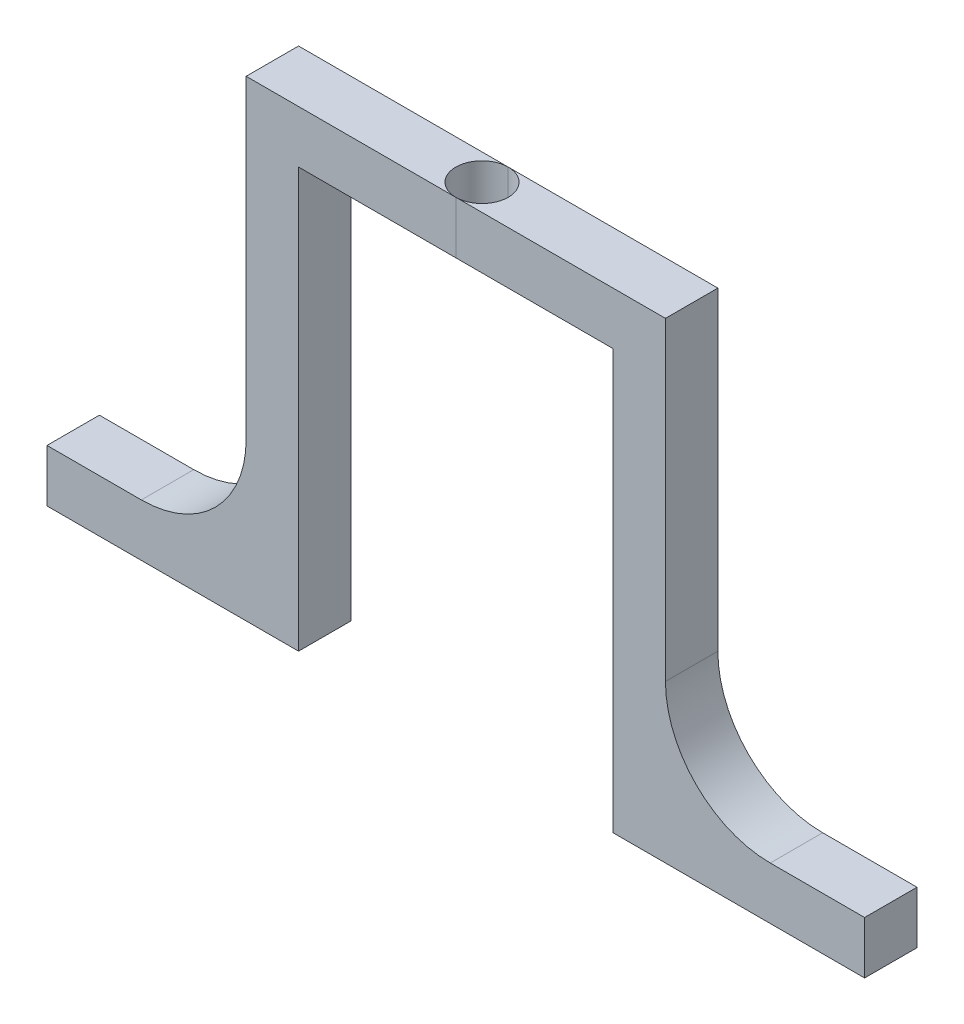
ISO-10303-21;
HEADER;
FILE_DESCRIPTION(('STEP AP214'),'2;1');
FILE_NAME('part.step','',(''),(''),'','','');
FILE_SCHEMA(('AUTOMOTIVE_DESIGN { 1 0 10303 214 1 1 1 1 }'));
ENDSEC;
DATA;
#1=APPLICATION_CONTEXT('core data for automotive mechanical design processes');
#2=APPLICATION_PROTOCOL_DEFINITION('international standard','automotive_design',2000,#1);
#3=PRODUCT_CONTEXT('',#1,'mechanical');
#4=PRODUCT('Part','Part','',(#3));
#5=PRODUCT_RELATED_PRODUCT_CATEGORY('part','',(#4));
#6=PRODUCT_DEFINITION_FORMATION('','',#4);
#7=PRODUCT_DEFINITION_CONTEXT('part definition',#1,'design');
#8=PRODUCT_DEFINITION('design','',#6,#7);
#9=PRODUCT_DEFINITION_SHAPE('','',#8);
#10=(LENGTH_UNIT() NAMED_UNIT(*) SI_UNIT(.MILLI.,.METRE.));
#11=(NAMED_UNIT(*) PLANE_ANGLE_UNIT() SI_UNIT($,.RADIAN.));
#12=(NAMED_UNIT(*) SI_UNIT($,.STERADIAN.) SOLID_ANGLE_UNIT());
#13=UNCERTAINTY_MEASURE_WITH_UNIT(LENGTH_MEASURE(1.E-05),#10,'distance_accuracy_value','');
#14=(GEOMETRIC_REPRESENTATION_CONTEXT(3) GLOBAL_UNCERTAINTY_ASSIGNED_CONTEXT((#13)) GLOBAL_UNIT_ASSIGNED_CONTEXT((#10,
#11,#12)) REPRESENTATION_CONTEXT('',''));
#15=CARTESIAN_POINT('',(0.,0.,0.));
#16=DIRECTION('',(0.,0.,1.));
#17=DIRECTION('',(1.,0.,0.));
#18=AXIS2_PLACEMENT_3D('',#15,#16,#17);
#19=CARTESIAN_POINT('',(0.,0.,5.));
#20=DIRECTION('',(0.,0.,1.));
#21=DIRECTION('',(1.,0.,0.));
#22=AXIS2_PLACEMENT_3D('',#19,#20,#21);
#23=PLANE('',#22);
#24=DIRECTION('',(1.,0.,0.));
#25=VECTOR('',#24,1.);
#26=CARTESIAN_POINT('',(23.9999999999999,40.,5.));
#27=LINE('',#26,#25);
#28=CARTESIAN_POINT('',(23.9999999999999,40.,5.));
#29=VERTEX_POINT('',#28);
#30=CARTESIAN_POINT('',(39.,40.,5.));
#31=VERTEX_POINT('',#30);
#32=EDGE_CURVE('E170',#29,#31,#27,.T.);
#33=ORIENTED_EDGE('',*,*,#32,.T.);
#34=DIRECTION('',(0.,1.,0.));
#35=VECTOR('',#34,1.);
#36=CARTESIAN_POINT('',(39.,32.9289321881345,5.));
#37=LINE('',#36,#35);
#38=CARTESIAN_POINT('',(39.,45.,5.));
#39=VERTEX_POINT('',#38);
#40=EDGE_CURVE('E58',#31,#39,#37,.T.);
#41=ORIENTED_EDGE('',*,*,#40,.T.);
#42=DIRECTION('',(-1.,0.,0.));
#43=VECTOR('',#42,1.);
#44=CARTESIAN_POINT('',(59.0000000000002,45.,5.));
#45=LINE('',#44,#43);
#46=CARTESIAN_POINT('',(18.9999999999998,45.,5.));
#47=VERTEX_POINT('',#46);
#48=EDGE_CURVE('E167',#39,#47,#45,.T.);
#49=ORIENTED_EDGE('',*,*,#48,.T.);
#50=DIRECTION('',(0.,-1.,0.));
#51=VECTOR('',#50,1.);
#52=CARTESIAN_POINT('',(19.,5.,5.));
#53=LINE('',#52,#51);
#54=CARTESIAN_POINT('',(18.9999999999999,15.,5.));
#55=VERTEX_POINT('',#54);
#56=EDGE_CURVE('E164',#47,#55,#53,.T.);
#57=ORIENTED_EDGE('',*,*,#56,.T.);
#58=CARTESIAN_POINT('',(8.99999999999994,15.,5.));
#59=DIRECTION('',(0.,0.,1.));
#60=DIRECTION('',(1.,0.,0.));
#61=AXIS2_PLACEMENT_3D('',#58,#59,#60);
#62=CIRCLE('',#61,10.);
#63=CARTESIAN_POINT('',(8.99999999999994,5.,5.));
#64=VERTEX_POINT('',#63);
#65=EDGE_CURVE('E163',#55,#64,#62,.F.);
#66=ORIENTED_EDGE('',*,*,#65,.T.);
#67=DIRECTION('',(-1.,0.,0.));
#68=VECTOR('',#67,1.);
#69=CARTESIAN_POINT('',(0.,5.,5.));
#70=LINE('',#69,#68);
#71=CARTESIAN_POINT('',(0.,5.,5.));
#72=VERTEX_POINT('',#71);
#73=EDGE_CURVE('E124',#64,#72,#70,.T.);
#74=ORIENTED_EDGE('',*,*,#73,.T.);
#75=DIRECTION('',(0.,-1.,0.));
#76=VECTOR('',#75,1.);
#77=CARTESIAN_POINT('',(0.,5.,5.));
#78=LINE('',#77,#76);
#79=CARTESIAN_POINT('',(0.,0.,5.));
#80=VERTEX_POINT('',#79);
#81=EDGE_CURVE('E120',#72,#80,#78,.T.);
#82=ORIENTED_EDGE('',*,*,#81,.T.);
#83=DIRECTION('',(1.,0.,0.));
#84=VECTOR('',#83,1.);
#85=CARTESIAN_POINT('',(0.,0.,5.));
#86=LINE('',#85,#84);
#87=CARTESIAN_POINT('',(24.,0.,5.));
#88=VERTEX_POINT('',#87);
#89=EDGE_CURVE('E109',#80,#88,#86,.T.);
#90=ORIENTED_EDGE('',*,*,#89,.T.);
#91=DIRECTION('',(0.,1.,0.));
#92=VECTOR('',#91,1.);
#93=CARTESIAN_POINT('',(24.,0.,5.));
#94=LINE('',#93,#92);
#95=EDGE_CURVE('E119',#88,#29,#94,.T.);
#96=ORIENTED_EDGE('',*,*,#95,.T.);
#97=EDGE_LOOP('',(#33,#41,#49,#57,#66,#74,#82,#90,#96));
#98=FACE_BOUND('',#97,.T.);
#99=ADVANCED_FACE('F43',(#98),#23,.T.);
#100=CARTESIAN_POINT('',(0.,0.,0.));
#101=DIRECTION('',(0.,0.,1.));
#102=DIRECTION('',(1.,0.,0.));
#103=AXIS2_PLACEMENT_3D('',#100,#101,#102);
#104=PLANE('',#103);
#105=DIRECTION('',(0.,1.,0.));
#106=VECTOR('',#105,1.);
#107=CARTESIAN_POINT('',(39.,32.9289321881345,0.));
#108=LINE('',#107,#106);
#109=CARTESIAN_POINT('',(39.,40.,0.));
#110=VERTEX_POINT('',#109);
#111=CARTESIAN_POINT('',(39.,45.,0.));
#112=VERTEX_POINT('',#111);
#113=EDGE_CURVE('E52',#110,#112,#108,.T.);
#114=ORIENTED_EDGE('',*,*,#113,.F.);
#115=DIRECTION('',(1.,0.,0.));
#116=VECTOR('',#115,1.);
#117=CARTESIAN_POINT('',(54.0000000000001,40.,0.));
#118=LINE('',#117,#116);
#119=CARTESIAN_POINT('',(23.9999999999999,40.,0.));
#120=VERTEX_POINT('',#119);
#121=EDGE_CURVE('E144',#120,#110,#118,.T.);
#122=ORIENTED_EDGE('',*,*,#121,.F.);
#123=DIRECTION('',(0.,1.,0.));
#124=VECTOR('',#123,1.);
#125=CARTESIAN_POINT('',(24.,0.,0.));
#126=LINE('',#125,#124);
#127=CARTESIAN_POINT('',(24.,0.,0.));
#128=VERTEX_POINT('',#127);
#129=EDGE_CURVE('E132',#128,#120,#126,.T.);
#130=ORIENTED_EDGE('',*,*,#129,.F.);
#131=DIRECTION('',(1.,0.,0.));
#132=VECTOR('',#131,1.);
#133=CARTESIAN_POINT('',(0.,0.,0.));
#134=LINE('',#133,#132);
#135=CARTESIAN_POINT('',(0.,0.,0.));
#136=VERTEX_POINT('',#135);
#137=EDGE_CURVE('E133',#136,#128,#134,.T.);
#138=ORIENTED_EDGE('',*,*,#137,.F.);
#139=DIRECTION('',(0.,-1.,0.));
#140=VECTOR('',#139,1.);
#141=CARTESIAN_POINT('',(0.,5.,0.));
#142=LINE('',#141,#140);
#143=CARTESIAN_POINT('',(0.,5.,0.));
#144=VERTEX_POINT('',#143);
#145=EDGE_CURVE('E131',#144,#136,#142,.T.);
#146=ORIENTED_EDGE('',*,*,#145,.F.);
#147=DIRECTION('',(-1.,0.,0.));
#148=VECTOR('',#147,1.);
#149=CARTESIAN_POINT('',(0.,5.,0.));
#150=LINE('',#149,#148);
#151=CARTESIAN_POINT('',(8.99999999999994,5.,0.));
#152=VERTEX_POINT('',#151);
#153=EDGE_CURVE('E154',#152,#144,#150,.T.);
#154=ORIENTED_EDGE('',*,*,#153,.F.);
#155=CARTESIAN_POINT('',(8.99999999999994,15.,0.));
#156=DIRECTION('',(0.,0.,1.));
#157=DIRECTION('',(1.,0.,0.));
#158=AXIS2_PLACEMENT_3D('',#155,#156,#157);
#159=CIRCLE('',#158,10.);
#160=CARTESIAN_POINT('',(18.9999999999999,15.,0.));
#161=VERTEX_POINT('',#160);
#162=EDGE_CURVE('E161',#152,#161,#159,.T.);
#163=ORIENTED_EDGE('',*,*,#162,.T.);
#164=DIRECTION('',(0.,-1.,0.));
#165=VECTOR('',#164,1.);
#166=CARTESIAN_POINT('',(19.,5.,0.));
#167=LINE('',#166,#165);
#168=CARTESIAN_POINT('',(18.9999999999998,45.,0.));
#169=VERTEX_POINT('',#168);
#170=EDGE_CURVE('E157',#169,#161,#167,.T.);
#171=ORIENTED_EDGE('',*,*,#170,.F.);
#172=DIRECTION('',(-1.,0.,0.));
#173=VECTOR('',#172,1.);
#174=CARTESIAN_POINT('',(18.9999999999998,45.,0.));
#175=LINE('',#174,#173);
#176=EDGE_CURVE('E148',#112,#169,#175,.T.);
#177=ORIENTED_EDGE('',*,*,#176,.F.);
#178=EDGE_LOOP('',(#114,#122,#130,#138,#146,#154,#163,#171,#177));
#179=FACE_BOUND('',#178,.T.);
#180=ADVANCED_FACE('F182',(#179),#104,.F.);
#181=CARTESIAN_POINT('',(0.,5.,5.));
#182=DIRECTION('',(1.,0.,0.));
#183=DIRECTION('',(0.,0.,-1.));
#184=AXIS2_PLACEMENT_3D('',#181,#182,#183);
#185=PLANE('',#184);
#186=ORIENTED_EDGE('',*,*,#145,.T.);
#187=DIRECTION('',(0.,0.,-1.));
#188=VECTOR('',#187,1.);
#189=CARTESIAN_POINT('',(0.,0.,5.));
#190=LINE('',#189,#188);
#191=EDGE_CURVE('E113',#80,#136,#190,.T.);
#192=ORIENTED_EDGE('',*,*,#191,.F.);
#193=ORIENTED_EDGE('',*,*,#81,.F.);
#194=DIRECTION('',(0.,0.,-1.));
#195=VECTOR('',#194,1.);
#196=CARTESIAN_POINT('',(0.,5.,5.));
#197=LINE('',#196,#195);
#198=EDGE_CURVE('E137',#72,#144,#197,.T.);
#199=ORIENTED_EDGE('',*,*,#198,.T.);
#200=EDGE_LOOP('',(#186,#192,#193,#199));
#201=FACE_BOUND('',#200,.T.);
#202=ADVANCED_FACE('F129',(#201),#185,.F.);
#203=CARTESIAN_POINT('',(0.,0.,5.));
#204=DIRECTION('',(0.,1.,0.));
#205=DIRECTION('',(0.,0.,1.));
#206=AXIS2_PLACEMENT_3D('',#203,#204,#205);
#207=PLANE('',#206);
#208=ORIENTED_EDGE('',*,*,#137,.T.);
#209=DIRECTION('',(0.,0.,-1.));
#210=VECTOR('',#209,1.);
#211=CARTESIAN_POINT('',(24.,0.,5.));
#212=LINE('',#211,#210);
#213=EDGE_CURVE('E116',#88,#128,#212,.T.);
#214=ORIENTED_EDGE('',*,*,#213,.F.);
#215=ORIENTED_EDGE('',*,*,#89,.F.);
#216=ORIENTED_EDGE('',*,*,#191,.T.);
#217=EDGE_LOOP('',(#208,#214,#215,#216));
#218=FACE_BOUND('',#217,.T.);
#219=ADVANCED_FACE('F111',(#218),#207,.F.);
#220=CARTESIAN_POINT('',(24.,0.,5.));
#221=DIRECTION('',(-1.,0.,0.));
#222=DIRECTION('',(0.,-1.,0.));
#223=AXIS2_PLACEMENT_3D('',#220,#221,#222);
#224=PLANE('',#223);
#225=ORIENTED_EDGE('',*,*,#129,.T.);
#226=DIRECTION('',(0.,0.,-1.));
#227=VECTOR('',#226,1.);
#228=CARTESIAN_POINT('',(23.9999999999999,40.,5.));
#229=LINE('',#228,#227);
#230=EDGE_CURVE('E145',#29,#120,#229,.T.);
#231=ORIENTED_EDGE('',*,*,#230,.F.);
#232=ORIENTED_EDGE('',*,*,#95,.F.);
#233=ORIENTED_EDGE('',*,*,#213,.T.);
#234=EDGE_LOOP('',(#225,#231,#232,#233));
#235=FACE_BOUND('',#234,.T.);
#236=ADVANCED_FACE('F189',(#235),#224,.F.);
#237=CARTESIAN_POINT('',(54.0000000000001,40.,5.));
#238=DIRECTION('',(0.,1.,0.));
#239=DIRECTION('',(-1.,0.,0.));
#240=AXIS2_PLACEMENT_3D('',#237,#238,#239);
#241=PLANE('',#240);
#242=ORIENTED_EDGE('',*,*,#121,.T.);
#243=CARTESIAN_POINT('',(39.,40.,2.50000000000001));
#244=DIRECTION('',(0.,1.,0.));
#245=DIRECTION('',(-1.,0.,0.));
#246=AXIS2_PLACEMENT_3D('',#243,#244,#245);
#247=CIRCLE('',#246,2.5);
#248=EDGE_CURVE('E156',#31,#110,#247,.F.);
#249=ORIENTED_EDGE('',*,*,#248,.F.);
#250=ORIENTED_EDGE('',*,*,#32,.F.);
#251=ORIENTED_EDGE('',*,*,#230,.T.);
#252=EDGE_LOOP('',(#242,#249,#250,#251));
#253=FACE_BOUND('',#252,.T.);
#254=ADVANCED_FACE('F186',(#253),#241,.F.);
#255=CARTESIAN_POINT('',(18.9999999999998,45.,5.));
#256=DIRECTION('',(0.,-1.,0.));
#257=DIRECTION('',(0.,0.,-1.));
#258=AXIS2_PLACEMENT_3D('',#255,#256,#257);
#259=PLANE('',#258);
#260=ORIENTED_EDGE('',*,*,#48,.F.);
#261=CARTESIAN_POINT('',(39.,45.,2.50000000000001));
#262=DIRECTION('',(0.,1.,0.));
#263=DIRECTION('',(0.,0.,1.));
#264=AXIS2_PLACEMENT_3D('',#261,#262,#263);
#265=CIRCLE('',#264,2.5);
#266=EDGE_CURVE('E12',#112,#39,#265,.T.);
#267=ORIENTED_EDGE('',*,*,#266,.F.);
#268=ORIENTED_EDGE('',*,*,#176,.T.);
#269=DIRECTION('',(0.,0.,-1.));
#270=VECTOR('',#269,1.);
#271=CARTESIAN_POINT('',(18.9999999999998,45.,5.));
#272=LINE('',#271,#270);
#273=EDGE_CURVE('E149',#47,#169,#272,.T.);
#274=ORIENTED_EDGE('',*,*,#273,.F.);
#275=EDGE_LOOP('',(#260,#267,#268,#274));
#276=FACE_BOUND('',#275,.T.);
#277=ADVANCED_FACE('F207',(#276),#259,.F.);
#278=CARTESIAN_POINT('',(19.,5.,5.));
#279=DIRECTION('',(1.,0.,0.));
#280=DIRECTION('',(0.,1.,0.));
#281=AXIS2_PLACEMENT_3D('',#278,#279,#280);
#282=PLANE('',#281);
#283=ORIENTED_EDGE('',*,*,#170,.T.);
#284=DIRECTION('',(0.,0.,-1.));
#285=VECTOR('',#284,1.);
#286=CARTESIAN_POINT('',(18.9999999999999,15.,5.));
#287=LINE('',#286,#285);
#288=EDGE_CURVE('E152',#161,#55,#287,.F.);
#289=ORIENTED_EDGE('',*,*,#288,.T.);
#290=ORIENTED_EDGE('',*,*,#56,.F.);
#291=ORIENTED_EDGE('',*,*,#273,.T.);
#292=EDGE_LOOP('',(#283,#289,#290,#291));
#293=FACE_BOUND('',#292,.T.);
#294=ADVANCED_FACE('F203',(#293),#282,.F.);
#295=CARTESIAN_POINT('',(0.,5.,5.));
#296=DIRECTION('',(0.,-1.,0.));
#297=DIRECTION('',(0.,0.,-1.));
#298=AXIS2_PLACEMENT_3D('',#295,#296,#297);
#299=PLANE('',#298);
#300=ORIENTED_EDGE('',*,*,#73,.F.);
#301=DIRECTION('',(0.,0.,-1.));
#302=VECTOR('',#301,1.);
#303=CARTESIAN_POINT('',(8.99999999999994,5.,0.));
#304=LINE('',#303,#302);
#305=EDGE_CURVE('E141',#64,#152,#304,.T.);
#306=ORIENTED_EDGE('',*,*,#305,.T.);
#307=ORIENTED_EDGE('',*,*,#153,.T.);
#308=ORIENTED_EDGE('',*,*,#198,.F.);
#309=EDGE_LOOP('',(#300,#306,#307,#308));
#310=FACE_BOUND('',#309,.T.);
#311=ADVANCED_FACE('F193',(#310),#299,.F.);
#312=CARTESIAN_POINT('',(8.99999999999994,15.,5.));
#313=DIRECTION('',(0.,0.,1.));
#314=DIRECTION('',(1.,0.,0.));
#315=AXIS2_PLACEMENT_3D('',#312,#313,#314);
#316=CYLINDRICAL_SURFACE('',#315,10.);
#317=ORIENTED_EDGE('',*,*,#65,.F.);
#318=ORIENTED_EDGE('',*,*,#288,.F.);
#319=ORIENTED_EDGE('',*,*,#162,.F.);
#320=ORIENTED_EDGE('',*,*,#305,.F.);
#321=EDGE_LOOP('',(#317,#318,#319,#320));
#322=FACE_BOUND('',#321,.T.);
#323=ADVANCED_FACE('F197',(#322),#316,.F.);
#324=CARTESIAN_POINT('',(39.,32.9289321881345,2.50000000000001));
#325=DIRECTION('',(0.,1.,0.));
#326=DIRECTION('',(0.,0.,1.));
#327=AXIS2_PLACEMENT_3D('',#324,#325,#326);
#328=CYLINDRICAL_SURFACE('',#327,2.5);
#329=ORIENTED_EDGE('',*,*,#248,.T.);
#330=ORIENTED_EDGE('',*,*,#113,.T.);
#331=ORIENTED_EDGE('',*,*,#266,.T.);
#332=ORIENTED_EDGE('',*,*,#40,.F.);
#333=EDGE_LOOP('',(#329,#330,#331,#332));
#334=FACE_BOUND('',#333,.T.);
#335=ADVANCED_FACE('F45',(#334),#328,.F.);
#336=CLOSED_SHELL('',(#99,#180,#202,#219,#236,#254,#277,#294,#311,#323,#335));
#337=MANIFOLD_SOLID_BREP('B2',#336);
#338=CARTESIAN_POINT('',(54.,0.,5.));
#339=DIRECTION('',(1.,0.,0.));
#340=DIRECTION('',(0.,1.,0.));
#341=AXIS2_PLACEMENT_3D('',#338,#339,#340);
#342=PLANE('',#341);
#343=DIRECTION('',(0.,-1.,0.));
#344=VECTOR('',#343,1.);
#345=CARTESIAN_POINT('',(54.,0.,0.));
#346=LINE('',#345,#344);
#347=CARTESIAN_POINT('',(54.0000000000001,40.,0.));
#348=VERTEX_POINT('',#347);
#349=CARTESIAN_POINT('',(54.,0.,0.));
#350=VERTEX_POINT('',#349);
#351=EDGE_CURVE('E407',#348,#350,#346,.T.);
#352=ORIENTED_EDGE('',*,*,#351,.T.);
#353=DIRECTION('',(0.,0.,-1.));
#354=VECTOR('',#353,1.);
#355=CARTESIAN_POINT('',(54.,0.,5.));
#356=LINE('',#355,#354);
#357=CARTESIAN_POINT('',(54.,0.,5.));
#358=VERTEX_POINT('',#357);
#359=EDGE_CURVE('E425',#358,#350,#356,.T.);
#360=ORIENTED_EDGE('',*,*,#359,.F.);
#361=DIRECTION('',(0.,-1.,0.));
#362=VECTOR('',#361,1.);
#363=CARTESIAN_POINT('',(54.,0.,5.));
#364=LINE('',#363,#362);
#365=CARTESIAN_POINT('',(54.0000000000001,40.,5.));
#366=VERTEX_POINT('',#365);
#367=EDGE_CURVE('E387',#366,#358,#364,.T.);
#368=ORIENTED_EDGE('',*,*,#367,.F.);
#369=DIRECTION('',(0.,0.,-1.));
#370=VECTOR('',#369,1.);
#371=CARTESIAN_POINT('',(54.0000000000001,40.,5.));
#372=LINE('',#371,#370);
#373=EDGE_CURVE('E385',#366,#348,#372,.T.);
#374=ORIENTED_EDGE('',*,*,#373,.T.);
#375=EDGE_LOOP('',(#352,#360,#368,#374));
#376=FACE_BOUND('',#375,.T.);
#377=ADVANCED_FACE('F303',(#376),#342,.F.);
#378=CARTESIAN_POINT('',(78.,0.,5.));
#379=DIRECTION('',(0.,1.,0.));
#380=DIRECTION('',(-1.,0.,0.));
#381=AXIS2_PLACEMENT_3D('',#378,#379,#380);
#382=PLANE('',#381);
#383=DIRECTION('',(1.,0.,0.));
#384=VECTOR('',#383,1.);
#385=CARTESIAN_POINT('',(78.,0.,0.));
#386=LINE('',#385,#384);
#387=CARTESIAN_POINT('',(78.,0.,0.));
#388=VERTEX_POINT('',#387);
#389=EDGE_CURVE('E409',#350,#388,#386,.T.);
#390=ORIENTED_EDGE('',*,*,#389,.T.);
#391=DIRECTION('',(0.,0.,-1.));
#392=VECTOR('',#391,1.);
#393=CARTESIAN_POINT('',(78.,0.,5.));
#394=LINE('',#393,#392);
#395=CARTESIAN_POINT('',(78.,0.,5.));
#396=VERTEX_POINT('',#395);
#397=EDGE_CURVE('E422',#396,#388,#394,.T.);
#398=ORIENTED_EDGE('',*,*,#397,.F.);
#399=DIRECTION('',(1.,0.,0.));
#400=VECTOR('',#399,1.);
#401=CARTESIAN_POINT('',(78.,0.,5.));
#402=LINE('',#401,#400);
#403=EDGE_CURVE('E390',#358,#396,#402,.T.);
#404=ORIENTED_EDGE('',*,*,#403,.F.);
#405=ORIENTED_EDGE('',*,*,#359,.T.);
#406=EDGE_LOOP('',(#390,#398,#404,#405));
#407=FACE_BOUND('',#406,.T.);
#408=ADVANCED_FACE('F466',(#407),#382,.F.);
#409=CARTESIAN_POINT('',(78.,5.00000000000001,5.));
#410=DIRECTION('',(-1.,0.,0.));
#411=DIRECTION('',(0.,0.,1.));
#412=AXIS2_PLACEMENT_3D('',#409,#410,#411);
#413=PLANE('',#412);
#414=DIRECTION('',(0.,1.,0.));
#415=VECTOR('',#414,1.);
#416=CARTESIAN_POINT('',(78.,5.00000000000001,0.));
#417=LINE('',#416,#415);
#418=CARTESIAN_POINT('',(78.,5.00000000000001,0.));
#419=VERTEX_POINT('',#418);
#420=EDGE_CURVE('E411',#388,#419,#417,.T.);
#421=ORIENTED_EDGE('',*,*,#420,.T.);
#422=DIRECTION('',(0.,0.,-1.));
#423=VECTOR('',#422,1.);
#424=CARTESIAN_POINT('',(78.,5.00000000000001,5.));
#425=LINE('',#424,#423);
#426=CARTESIAN_POINT('',(78.,5.00000000000001,5.));
#427=VERTEX_POINT('',#426);
#428=EDGE_CURVE('E419',#427,#419,#425,.T.);
#429=ORIENTED_EDGE('',*,*,#428,.F.);
#430=DIRECTION('',(0.,1.,0.));
#431=VECTOR('',#430,1.);
#432=CARTESIAN_POINT('',(78.,5.00000000000001,5.));
#433=LINE('',#432,#431);
#434=EDGE_CURVE('E397',#396,#427,#433,.T.);
#435=ORIENTED_EDGE('',*,*,#434,.F.);
#436=ORIENTED_EDGE('',*,*,#397,.T.);
#437=EDGE_LOOP('',(#421,#429,#435,#436));
#438=FACE_BOUND('',#437,.T.);
#439=ADVANCED_FACE('F463',(#438),#413,.F.);
#440=CARTESIAN_POINT('',(78.,5.00000000000001,5.));
#441=DIRECTION('',(0.,-1.,0.));
#442=DIRECTION('',(1.,0.,0.));
#443=AXIS2_PLACEMENT_3D('',#440,#441,#442);
#444=PLANE('',#443);
#445=DIRECTION('',(-1.,0.,0.));
#446=VECTOR('',#445,1.);
#447=CARTESIAN_POINT('',(78.,5.00000000000001,0.));
#448=LINE('',#447,#446);
#449=CARTESIAN_POINT('',(69.,5.00000000000001,0.));
#450=VERTEX_POINT('',#449);
#451=EDGE_CURVE('E413',#419,#450,#448,.T.);
#452=ORIENTED_EDGE('',*,*,#451,.T.);
#453=DIRECTION('',(0.,0.,-1.));
#454=VECTOR('',#453,1.);
#455=CARTESIAN_POINT('',(69.,5.00000000000001,5.));
#456=LINE('',#455,#454);
#457=CARTESIAN_POINT('',(69.,5.00000000000001,5.));
#458=VERTEX_POINT('',#457);
#459=EDGE_CURVE('E432',#450,#458,#456,.F.);
#460=ORIENTED_EDGE('',*,*,#459,.T.);
#461=DIRECTION('',(-1.,0.,0.));
#462=VECTOR('',#461,1.);
#463=CARTESIAN_POINT('',(78.,5.00000000000001,5.));
#464=LINE('',#463,#462);
#465=EDGE_CURVE('E399',#427,#458,#464,.T.);
#466=ORIENTED_EDGE('',*,*,#465,.F.);
#467=ORIENTED_EDGE('',*,*,#428,.T.);
#468=EDGE_LOOP('',(#452,#460,#466,#467));
#469=FACE_BOUND('',#468,.T.);
#470=ADVANCED_FACE('F454',(#469),#444,.F.);
#471=CARTESIAN_POINT('',(69.,15.,5.));
#472=DIRECTION('',(0.,0.,1.));
#473=DIRECTION('',(1.,0.,0.));
#474=AXIS2_PLACEMENT_3D('',#471,#472,#473);
#475=CYLINDRICAL_SURFACE('',#474,10.);
#476=CARTESIAN_POINT('',(69.,15.,5.));
#477=DIRECTION('',(0.,0.,1.));
#478=DIRECTION('',(1.,0.,0.));
#479=AXIS2_PLACEMENT_3D('',#476,#477,#478);
#480=CIRCLE('',#479,10.);
#481=CARTESIAN_POINT('',(59.,15.,5.));
#482=VERTEX_POINT('',#481);
#483=EDGE_CURVE('E435',#458,#482,#480,.F.);
#484=ORIENTED_EDGE('',*,*,#483,.F.);
#485=ORIENTED_EDGE('',*,*,#459,.F.);
#486=CARTESIAN_POINT('',(69.,15.,0.));
#487=DIRECTION('',(0.,0.,1.));
#488=DIRECTION('',(1.,0.,0.));
#489=AXIS2_PLACEMENT_3D('',#486,#487,#488);
#490=CIRCLE('',#489,10.);
#491=CARTESIAN_POINT('',(59.,15.,0.));
#492=VERTEX_POINT('',#491);
#493=EDGE_CURVE('E434',#492,#450,#490,.T.);
#494=ORIENTED_EDGE('',*,*,#493,.F.);
#495=DIRECTION('',(0.,0.,-1.));
#496=VECTOR('',#495,1.);
#497=CARTESIAN_POINT('',(59.,15.,0.));
#498=LINE('',#497,#496);
#499=EDGE_CURVE('E429',#482,#492,#498,.T.);
#500=ORIENTED_EDGE('',*,*,#499,.F.);
#501=EDGE_LOOP('',(#484,#485,#494,#500));
#502=FACE_BOUND('',#501,.T.);
#503=ADVANCED_FACE('F305',(#502),#475,.F.);
#504=CARTESIAN_POINT('',(59.,5.00000000000001,5.));
#505=DIRECTION('',(-1.,0.,0.));
#506=DIRECTION('',(0.,-1.,0.));
#507=AXIS2_PLACEMENT_3D('',#504,#505,#506);
#508=PLANE('',#507);
#509=DIRECTION('',(0.,1.,0.));
#510=VECTOR('',#509,1.);
#511=CARTESIAN_POINT('',(59.,5.00000000000001,5.));
#512=LINE('',#511,#510);
#513=CARTESIAN_POINT('',(59.0000000000002,45.,5.));
#514=VERTEX_POINT('',#513);
#515=EDGE_CURVE('E402',#482,#514,#512,.T.);
#516=ORIENTED_EDGE('',*,*,#515,.F.);
#517=ORIENTED_EDGE('',*,*,#499,.T.);
#518=DIRECTION('',(0.,1.,0.));
#519=VECTOR('',#518,1.);
#520=CARTESIAN_POINT('',(59.,5.00000000000001,0.));
#521=LINE('',#520,#519);
#522=CARTESIAN_POINT('',(59.0000000000002,45.,0.));
#523=VERTEX_POINT('',#522);
#524=EDGE_CURVE('E393',#492,#523,#521,.T.);
#525=ORIENTED_EDGE('',*,*,#524,.T.);
#526=DIRECTION('',(0.,0.,-1.));
#527=VECTOR('',#526,1.);
#528=CARTESIAN_POINT('',(59.0000000000002,45.,5.));
#529=LINE('',#528,#527);
#530=EDGE_CURVE('E405',#514,#523,#529,.T.);
#531=ORIENTED_EDGE('',*,*,#530,.F.);
#532=EDGE_LOOP('',(#516,#517,#525,#531));
#533=FACE_BOUND('',#532,.T.);
#534=ADVANCED_FACE('F447',(#533),#508,.F.);
#535=CARTESIAN_POINT('',(0.,0.,5.));
#536=DIRECTION('',(0.,0.,1.));
#537=DIRECTION('',(1.,0.,0.));
#538=AXIS2_PLACEMENT_3D('',#535,#536,#537);
#539=PLANE('',#538);
#540=DIRECTION('',(0.,1.,0.));
#541=VECTOR('',#540,1.);
#542=CARTESIAN_POINT('',(39.,32.9289321881345,5.));
#543=LINE('',#542,#541);
#544=CARTESIAN_POINT('',(39.,40.,5.));
#545=VERTEX_POINT('',#544);
#546=CARTESIAN_POINT('',(39.,45.,5.));
#547=VERTEX_POINT('',#546);
#548=EDGE_CURVE('E41',#545,#547,#543,.T.);
#549=ORIENTED_EDGE('',*,*,#548,.F.);
#550=DIRECTION('',(1.,0.,0.));
#551=VECTOR('',#550,1.);
#552=CARTESIAN_POINT('',(23.9999999999999,40.,5.));
#553=LINE('',#552,#551);
#554=EDGE_CURVE('E378',#545,#366,#553,.T.);
#555=ORIENTED_EDGE('',*,*,#554,.T.);
#556=ORIENTED_EDGE('',*,*,#367,.T.);
#557=ORIENTED_EDGE('',*,*,#403,.T.);
#558=ORIENTED_EDGE('',*,*,#434,.T.);
#559=ORIENTED_EDGE('',*,*,#465,.T.);
#560=ORIENTED_EDGE('',*,*,#483,.T.);
#561=ORIENTED_EDGE('',*,*,#515,.T.);
#562=DIRECTION('',(-1.,0.,0.));
#563=VECTOR('',#562,1.);
#564=CARTESIAN_POINT('',(59.0000000000002,45.,5.));
#565=LINE('',#564,#563);
#566=EDGE_CURVE('E381',#514,#547,#565,.T.);
#567=ORIENTED_EDGE('',*,*,#566,.T.);
#568=EDGE_LOOP('',(#549,#555,#556,#557,#558,#559,#560,#561,#567));
#569=FACE_BOUND('',#568,.T.);
#570=ADVANCED_FACE('F377',(#569),#539,.T.);
#571=CARTESIAN_POINT('',(0.,0.,0.));
#572=DIRECTION('',(0.,0.,1.));
#573=DIRECTION('',(1.,0.,0.));
#574=AXIS2_PLACEMENT_3D('',#571,#572,#573);
#575=PLANE('',#574);
#576=DIRECTION('',(1.,0.,0.));
#577=VECTOR('',#576,1.);
#578=CARTESIAN_POINT('',(54.0000000000001,40.,0.));
#579=LINE('',#578,#577);
#580=CARTESIAN_POINT('',(39.,40.,0.));
#581=VERTEX_POINT('',#580);
#582=EDGE_CURVE('E373',#581,#348,#579,.T.);
#583=ORIENTED_EDGE('',*,*,#582,.F.);
#584=DIRECTION('',(0.,1.,0.));
#585=VECTOR('',#584,1.);
#586=CARTESIAN_POINT('',(39.,32.9289321881345,0.));
#587=LINE('',#586,#585);
#588=CARTESIAN_POINT('',(39.,45.,0.));
#589=VERTEX_POINT('',#588);
#590=EDGE_CURVE('E307',#581,#589,#587,.T.);
#591=ORIENTED_EDGE('',*,*,#590,.T.);
#592=DIRECTION('',(-1.,0.,0.));
#593=VECTOR('',#592,1.);
#594=CARTESIAN_POINT('',(18.9999999999998,45.,0.));
#595=LINE('',#594,#593);
#596=EDGE_CURVE('E388',#523,#589,#595,.T.);
#597=ORIENTED_EDGE('',*,*,#596,.F.);
#598=ORIENTED_EDGE('',*,*,#524,.F.);
#599=ORIENTED_EDGE('',*,*,#493,.T.);
#600=ORIENTED_EDGE('',*,*,#451,.F.);
#601=ORIENTED_EDGE('',*,*,#420,.F.);
#602=ORIENTED_EDGE('',*,*,#389,.F.);
#603=ORIENTED_EDGE('',*,*,#351,.F.);
#604=EDGE_LOOP('',(#583,#591,#597,#598,#599,#600,#601,#602,#603));
#605=FACE_BOUND('',#604,.T.);
#606=ADVANCED_FACE('F440',(#605),#575,.F.);
#607=CARTESIAN_POINT('',(18.9999999999998,45.,5.));
#608=DIRECTION('',(0.,-1.,0.));
#609=DIRECTION('',(0.,0.,-1.));
#610=AXIS2_PLACEMENT_3D('',#607,#608,#609);
#611=PLANE('',#610);
#612=ORIENTED_EDGE('',*,*,#596,.T.);
#613=CARTESIAN_POINT('',(39.,45.,2.50000000000001));
#614=DIRECTION('',(0.,1.,0.));
#615=DIRECTION('',(0.,0.,1.));
#616=AXIS2_PLACEMENT_3D('',#613,#614,#615);
#617=CIRCLE('',#616,2.5);
#618=EDGE_CURVE('E374',#547,#589,#617,.T.);
#619=ORIENTED_EDGE('',*,*,#618,.F.);
#620=ORIENTED_EDGE('',*,*,#566,.F.);
#621=ORIENTED_EDGE('',*,*,#530,.T.);
#622=EDGE_LOOP('',(#612,#619,#620,#621));
#623=FACE_BOUND('',#622,.T.);
#624=ADVANCED_FACE('F444',(#623),#611,.F.);
#625=CARTESIAN_POINT('',(54.0000000000001,40.,5.));
#626=DIRECTION('',(0.,1.,0.));
#627=DIRECTION('',(-1.,0.,0.));
#628=AXIS2_PLACEMENT_3D('',#625,#626,#627);
#629=PLANE('',#628);
#630=ORIENTED_EDGE('',*,*,#554,.F.);
#631=CARTESIAN_POINT('',(39.,40.,2.50000000000001));
#632=DIRECTION('',(0.,1.,0.));
#633=DIRECTION('',(-1.,0.,0.));
#634=AXIS2_PLACEMENT_3D('',#631,#632,#633);
#635=CIRCLE('',#634,2.5);
#636=EDGE_CURVE('E369',#581,#545,#635,.F.);
#637=ORIENTED_EDGE('',*,*,#636,.F.);
#638=ORIENTED_EDGE('',*,*,#582,.T.);
#639=ORIENTED_EDGE('',*,*,#373,.F.);
#640=EDGE_LOOP('',(#630,#637,#638,#639));
#641=FACE_BOUND('',#640,.T.);
#642=ADVANCED_FACE('F383',(#641),#629,.F.);
#643=CARTESIAN_POINT('',(39.,32.9289321881345,2.50000000000001));
#644=DIRECTION('',(0.,1.,0.));
#645=DIRECTION('',(0.,0.,1.));
#646=AXIS2_PLACEMENT_3D('',#643,#644,#645);
#647=CYLINDRICAL_SURFACE('',#646,2.5);
#648=ORIENTED_EDGE('',*,*,#548,.T.);
#649=ORIENTED_EDGE('',*,*,#618,.T.);
#650=ORIENTED_EDGE('',*,*,#590,.F.);
#651=ORIENTED_EDGE('',*,*,#636,.T.);
#652=EDGE_LOOP('',(#648,#649,#650,#651));
#653=FACE_BOUND('',#652,.T.);
#654=ADVANCED_FACE('F370',(#653),#647,.F.);
#655=CLOSED_SHELL('',(#377,#408,#439,#470,#503,#534,#570,#606,#624,#642,#654));
#656=MANIFOLD_SOLID_BREP('B6',#655);
#657=ADVANCED_BREP_SHAPE_REPRESENTATION('',(#18,#337,#656),#14);
#658=SHAPE_DEFINITION_REPRESENTATION(#9,#657);
ENDSEC;
END-ISO-10303-21;
